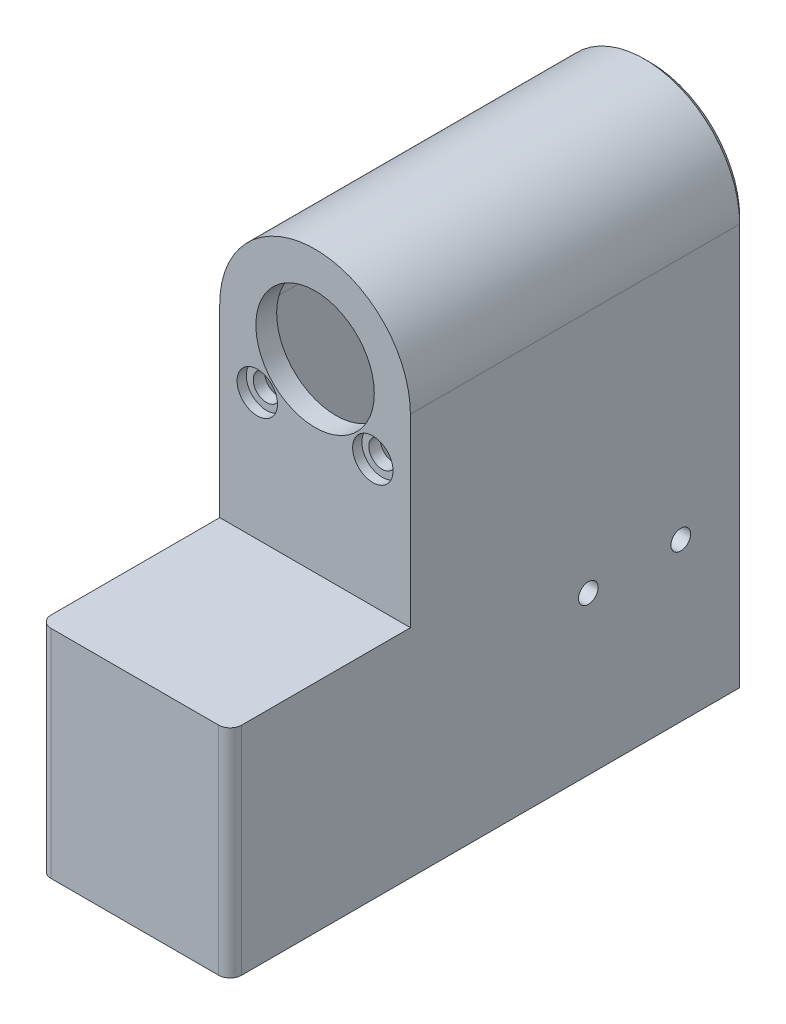
ISO-10303-21;
HEADER;
FILE_DESCRIPTION(('STEP AP214'),'2;1');
FILE_NAME('part.step','',(''),(''),'','','');
FILE_SCHEMA(('AUTOMOTIVE_DESIGN { 1 0 10303 214 1 1 1 1 }'));
ENDSEC;
DATA;
#1=APPLICATION_CONTEXT('core data for automotive mechanical design processes');
#2=APPLICATION_PROTOCOL_DEFINITION('international standard','automotive_design',2000,#1);
#3=PRODUCT_CONTEXT('',#1,'mechanical');
#4=PRODUCT('Part','Part','',(#3));
#5=PRODUCT_RELATED_PRODUCT_CATEGORY('part','',(#4));
#6=PRODUCT_DEFINITION_FORMATION('','',#4);
#7=PRODUCT_DEFINITION_CONTEXT('part definition',#1,'design');
#8=PRODUCT_DEFINITION('design','',#6,#7);
#9=PRODUCT_DEFINITION_SHAPE('','',#8);
#10=(LENGTH_UNIT() NAMED_UNIT(*) SI_UNIT(.MILLI.,.METRE.));
#11=(NAMED_UNIT(*) PLANE_ANGLE_UNIT() SI_UNIT($,.RADIAN.));
#12=(NAMED_UNIT(*) SI_UNIT($,.STERADIAN.) SOLID_ANGLE_UNIT());
#13=UNCERTAINTY_MEASURE_WITH_UNIT(LENGTH_MEASURE(1.E-05),#10,'distance_accuracy_value','');
#14=(GEOMETRIC_REPRESENTATION_CONTEXT(3) GLOBAL_UNCERTAINTY_ASSIGNED_CONTEXT((#13)) GLOBAL_UNIT_ASSIGNED_CONTEXT((#10,
#11,#12)) REPRESENTATION_CONTEXT('',''));
#15=CARTESIAN_POINT('',(0.,0.,0.));
#16=DIRECTION('',(0.,0.,1.));
#17=DIRECTION('',(1.,0.,0.));
#18=AXIS2_PLACEMENT_3D('',#15,#16,#17);
#19=CARTESIAN_POINT('',(37.8083261120685,38.3,40.2));
#20=DIRECTION('',(-1.,0.,0.));
#21=DIRECTION('',(0.,0.,1.));
#22=AXIS2_PLACEMENT_3D('',#19,#20,#21);
#23=CYLINDRICAL_SURFACE('',#22,1.7);
#24=CARTESIAN_POINT('',(3.8,38.3,40.2));
#25=DIRECTION('',(-1.,0.,0.));
#26=DIRECTION('',(0.,0.,1.));
#27=AXIS2_PLACEMENT_3D('',#24,#25,#26);
#28=CIRCLE('',#27,1.7);
#29=CARTESIAN_POINT('',(3.8,38.3,41.9));
#30=VERTEX_POINT('',#29);
#31=EDGE_CURVE('E222',#30,#30,#28,.F.);
#32=ORIENTED_EDGE('',*,*,#31,.T.);
#33=EDGE_LOOP('',(#32));
#34=FACE_BOUND('',#33,.T.);
#35=CARTESIAN_POINT('',(2.,38.3,40.2));
#36=DIRECTION('',(-1.,0.,0.));
#37=DIRECTION('',(0.,0.,1.));
#38=AXIS2_PLACEMENT_3D('',#35,#36,#37);
#39=CIRCLE('',#38,1.7);
#40=CARTESIAN_POINT('',(2.,38.3,41.9));
#41=VERTEX_POINT('',#40);
#42=EDGE_CURVE('E41',#41,#41,#39,.F.);
#43=ORIENTED_EDGE('',*,*,#42,.F.);
#44=EDGE_LOOP('',(#43));
#45=FACE_BOUND('',#44,.T.);
#46=ADVANCED_FACE('F37',(#34,#45),#23,.F.);
#47=CARTESIAN_POINT('',(37.8083261120685,38.3,24.2));
#48=DIRECTION('',(-1.,0.,0.));
#49=DIRECTION('',(0.,0.,1.));
#50=AXIS2_PLACEMENT_3D('',#47,#48,#49);
#51=CYLINDRICAL_SURFACE('',#50,1.7);
#52=CARTESIAN_POINT('',(3.8,38.3,24.2));
#53=DIRECTION('',(-1.,0.,0.));
#54=DIRECTION('',(0.,0.,1.));
#55=AXIS2_PLACEMENT_3D('',#52,#53,#54);
#56=CIRCLE('',#55,1.7);
#57=CARTESIAN_POINT('',(3.8,38.3,25.9));
#58=VERTEX_POINT('',#57);
#59=EDGE_CURVE('E208',#58,#58,#56,.F.);
#60=ORIENTED_EDGE('',*,*,#59,.T.);
#61=EDGE_LOOP('',(#60));
#62=FACE_BOUND('',#61,.T.);
#63=CARTESIAN_POINT('',(2.,38.3,24.2));
#64=DIRECTION('',(-1.,0.,0.));
#65=DIRECTION('',(0.,0.,1.));
#66=AXIS2_PLACEMENT_3D('',#63,#64,#65);
#67=CIRCLE('',#66,1.7);
#68=CARTESIAN_POINT('',(2.,38.3,25.9));
#69=VERTEX_POINT('',#68);
#70=EDGE_CURVE('E346',#69,#69,#67,.F.);
#71=ORIENTED_EDGE('',*,*,#70,.F.);
#72=EDGE_LOOP('',(#71));
#73=FACE_BOUND('',#72,.T.);
#74=ADVANCED_FACE('F417',(#62,#73),#51,.F.);
#75=CARTESIAN_POINT('',(16.5,80.5,13.));
#76=DIRECTION('',(0.,0.,-1.));
#77=DIRECTION('',(-1.,0.,0.));
#78=AXIS2_PLACEMENT_3D('',#75,#76,#77);
#79=PLANE('',#78);
#80=DIRECTION('',(-1.,0.,0.));
#81=VECTOR('',#80,1.);
#82=CARTESIAN_POINT('',(16.5,12.,13.));
#83=LINE('',#82,#81);
#84=CARTESIAN_POINT('',(3.8,12.,13.));
#85=VERTEX_POINT('',#84);
#86=CARTESIAN_POINT('',(1.00000000000001,12.,13.));
#87=VERTEX_POINT('',#86);
#88=EDGE_CURVE('E281',#85,#87,#83,.T.);
#89=ORIENTED_EDGE('',*,*,#88,.T.);
#90=DIRECTION('',(0.,1.,0.));
#91=VECTOR('',#90,1.);
#92=CARTESIAN_POINT('',(1.00000000000001,80.5,13.));
#93=LINE('',#92,#91);
#94=CARTESIAN_POINT('',(1.00000000000001,80.5,13.));
#95=VERTEX_POINT('',#94);
#96=EDGE_CURVE('E331',#87,#95,#93,.T.);
#97=ORIENTED_EDGE('',*,*,#96,.T.);
#98=CARTESIAN_POINT('',(16.5,80.5,13.));
#99=DIRECTION('',(0.,0.,-1.));
#100=DIRECTION('',(-1.,0.,0.));
#101=AXIS2_PLACEMENT_3D('',#98,#99,#100);
#102=CIRCLE('',#101,15.5);
#103=CARTESIAN_POINT('',(32.,80.5,13.));
#104=VERTEX_POINT('',#103);
#105=EDGE_CURVE('E329',#95,#104,#102,.T.);
#106=ORIENTED_EDGE('',*,*,#105,.T.);
#107=DIRECTION('',(0.,-1.,0.));
#108=VECTOR('',#107,1.);
#109=CARTESIAN_POINT('',(32.,12.,13.));
#110=LINE('',#109,#108);
#111=CARTESIAN_POINT('',(32.,12.,13.));
#112=VERTEX_POINT('',#111);
#113=EDGE_CURVE('E327',#104,#112,#110,.T.);
#114=ORIENTED_EDGE('',*,*,#113,.T.);
#115=DIRECTION('',(-1.,0.,0.));
#116=VECTOR('',#115,1.);
#117=CARTESIAN_POINT('',(16.5,12.,13.));
#118=LINE('',#117,#116);
#119=CARTESIAN_POINT('',(29.2,12.,13.));
#120=VERTEX_POINT('',#119);
#121=EDGE_CURVE('E279',#112,#120,#118,.T.);
#122=ORIENTED_EDGE('',*,*,#121,.T.);
#123=DIRECTION('',(0.,1.,0.));
#124=VECTOR('',#123,1.);
#125=CARTESIAN_POINT('',(29.2,11.,13.));
#126=LINE('',#125,#124);
#127=CARTESIAN_POINT('',(29.2,80.4999999999999,13.));
#128=VERTEX_POINT('',#127);
#129=EDGE_CURVE('E182',#120,#128,#126,.T.);
#130=ORIENTED_EDGE('',*,*,#129,.T.);
#131=CARTESIAN_POINT('',(16.5,80.4999999999999,13.));
#132=DIRECTION('',(0.,0.,1.));
#133=DIRECTION('',(1.,0.,0.));
#134=AXIS2_PLACEMENT_3D('',#131,#132,#133);
#135=CIRCLE('',#134,12.7);
#136=CARTESIAN_POINT('',(3.8,80.4999999999999,13.));
#137=VERTEX_POINT('',#136);
#138=EDGE_CURVE('E210',#128,#137,#135,.T.);
#139=ORIENTED_EDGE('',*,*,#138,.T.);
#140=DIRECTION('',(0.,1.,0.));
#141=VECTOR('',#140,1.);
#142=CARTESIAN_POINT('',(3.8,11.0000000000001,13.));
#143=LINE('',#142,#141);
#144=EDGE_CURVE('E213',#85,#137,#143,.T.);
#145=ORIENTED_EDGE('',*,*,#144,.F.);
#146=EDGE_LOOP('',(#89,#97,#106,#114,#122,#130,#139,#145));
#147=FACE_BOUND('',#146,.T.);
#148=ADVANCED_FACE('F425',(#147),#79,.T.);
#149=CARTESIAN_POINT('',(33.,38.3,40.2));
#150=DIRECTION('',(-1.,0.,0.));
#151=DIRECTION('',(0.,0.,1.));
#152=AXIS2_PLACEMENT_3D('',#149,#150,#151);
#153=CIRCLE('',#152,1.7);
#154=CARTESIAN_POINT('',(33.,38.3,41.9));
#155=VERTEX_POINT('',#154);
#156=EDGE_CURVE('E247',#155,#155,#153,.F.);
#157=ORIENTED_EDGE('',*,*,#156,.T.);
#158=EDGE_LOOP('',(#157));
#159=FACE_BOUND('',#158,.T.);
#160=CARTESIAN_POINT('',(29.2,38.3,40.2));
#161=DIRECTION('',(-1.,0.,0.));
#162=DIRECTION('',(0.,0.,1.));
#163=AXIS2_PLACEMENT_3D('',#160,#161,#162);
#164=CIRCLE('',#163,1.7);
#165=CARTESIAN_POINT('',(29.2,38.3,41.9));
#166=VERTEX_POINT('',#165);
#167=EDGE_CURVE('E193',#166,#166,#164,.F.);
#168=ORIENTED_EDGE('',*,*,#167,.F.);
#169=EDGE_LOOP('',(#168));
#170=FACE_BOUND('',#169,.T.);
#171=ADVANCED_FACE('F420',(#159,#170),#23,.F.);
#172=CARTESIAN_POINT('',(33.,38.3,24.2));
#173=DIRECTION('',(-1.,0.,0.));
#174=DIRECTION('',(0.,0.,1.));
#175=AXIS2_PLACEMENT_3D('',#172,#173,#174);
#176=CIRCLE('',#175,1.7);
#177=CARTESIAN_POINT('',(33.,38.3,25.9));
#178=VERTEX_POINT('',#177);
#179=EDGE_CURVE('E248',#178,#178,#176,.F.);
#180=ORIENTED_EDGE('',*,*,#179,.T.);
#181=EDGE_LOOP('',(#180));
#182=FACE_BOUND('',#181,.T.);
#183=CARTESIAN_POINT('',(29.2,38.3,24.2));
#184=DIRECTION('',(-1.,0.,0.));
#185=DIRECTION('',(0.,0.,1.));
#186=AXIS2_PLACEMENT_3D('',#183,#184,#185);
#187=CIRCLE('',#186,1.7);
#188=CARTESIAN_POINT('',(29.2,38.3,25.9));
#189=VERTEX_POINT('',#188);
#190=EDGE_CURVE('E225',#189,#189,#187,.F.);
#191=ORIENTED_EDGE('',*,*,#190,.F.);
#192=EDGE_LOOP('',(#191));
#193=FACE_BOUND('',#192,.T.);
#194=ADVANCED_FACE('F428',(#182,#193),#51,.F.);
#195=CARTESIAN_POINT('',(0.,11.,0.));
#196=DIRECTION('',(0.,-1.,0.));
#197=DIRECTION('',(0.,0.,-1.));
#198=AXIS2_PLACEMENT_3D('',#195,#196,#197);
#199=PLANE('',#198);
#200=DIRECTION('',(0.,0.,1.));
#201=VECTOR('',#200,1.);
#202=CARTESIAN_POINT('',(33.,11.,13.));
#203=LINE('',#202,#201);
#204=CARTESIAN_POINT('',(33.,11.,14.));
#205=VERTEX_POINT('',#204);
#206=CARTESIAN_POINT('',(33.,11.,100.2));
#207=VERTEX_POINT('',#206);
#208=EDGE_CURVE('E192',#205,#207,#203,.T.);
#209=ORIENTED_EDGE('',*,*,#208,.T.);
#210=CARTESIAN_POINT('',(31.,11.,100.2));
#211=DIRECTION('',(0.,-1.,0.));
#212=DIRECTION('',(0.,0.,-1.));
#213=AXIS2_PLACEMENT_3D('',#210,#211,#212);
#214=CIRCLE('',#213,2.);
#215=CARTESIAN_POINT('',(31.,11.,102.2));
#216=VERTEX_POINT('',#215);
#217=EDGE_CURVE('E319',#207,#216,#214,.T.);
#218=ORIENTED_EDGE('',*,*,#217,.T.);
#219=DIRECTION('',(-1.,0.,0.));
#220=VECTOR('',#219,1.);
#221=CARTESIAN_POINT('',(33.,11.,102.2));
#222=LINE('',#221,#220);
#223=CARTESIAN_POINT('',(2.,11.,102.2));
#224=VERTEX_POINT('',#223);
#225=EDGE_CURVE('E232',#216,#224,#222,.T.);
#226=ORIENTED_EDGE('',*,*,#225,.T.);
#227=CARTESIAN_POINT('',(2.,11.,100.2));
#228=DIRECTION('',(0.,-1.,0.));
#229=DIRECTION('',(0.,0.,-1.));
#230=AXIS2_PLACEMENT_3D('',#227,#228,#229);
#231=CIRCLE('',#230,2.);
#232=CARTESIAN_POINT('',(0.,11.,100.2));
#233=VERTEX_POINT('',#232);
#234=EDGE_CURVE('E317',#224,#233,#231,.T.);
#235=ORIENTED_EDGE('',*,*,#234,.T.);
#236=DIRECTION('',(0.,0.,-1.));
#237=VECTOR('',#236,1.);
#238=CARTESIAN_POINT('',(0.,11.,102.2));
#239=LINE('',#238,#237);
#240=CARTESIAN_POINT('',(0.,11.,14.));
#241=VERTEX_POINT('',#240);
#242=EDGE_CURVE('E235',#233,#241,#239,.T.);
#243=ORIENTED_EDGE('',*,*,#242,.T.);
#244=DIRECTION('',(1.,0.,0.));
#245=VECTOR('',#244,1.);
#246=CARTESIAN_POINT('',(0.,11.,14.));
#247=LINE('',#246,#245);
#248=CARTESIAN_POINT('',(3.8,11.0000000000001,14.));
#249=VERTEX_POINT('',#248);
#250=EDGE_CURVE('E274',#241,#249,#247,.T.);
#251=ORIENTED_EDGE('',*,*,#250,.T.);
#252=DIRECTION('',(0.,0.,-1.));
#253=VECTOR('',#252,1.);
#254=CARTESIAN_POINT('',(3.8,11.0000000000001,153.43487664895));
#255=LINE('',#254,#253);
#256=CARTESIAN_POINT('',(3.8,11.0000000000001,96.2));
#257=VERTEX_POINT('',#256);
#258=EDGE_CURVE('E215',#257,#249,#255,.T.);
#259=ORIENTED_EDGE('',*,*,#258,.F.);
#260=CARTESIAN_POINT('',(5.8,11.,96.2));
#261=DIRECTION('',(0.,-1.,0.));
#262=DIRECTION('',(0.,0.,-1.));
#263=AXIS2_PLACEMENT_3D('',#260,#261,#262);
#264=CIRCLE('',#263,2.);
#265=CARTESIAN_POINT('',(5.8,11.0000000000001,98.2));
#266=VERTEX_POINT('',#265);
#267=EDGE_CURVE('E325',#257,#266,#264,.F.);
#268=ORIENTED_EDGE('',*,*,#267,.T.);
#269=DIRECTION('',(-1.,0.,0.));
#270=VECTOR('',#269,1.);
#271=CARTESIAN_POINT('',(29.2,11.,98.2));
#272=LINE('',#271,#270);
#273=CARTESIAN_POINT('',(27.2,11.,98.2));
#274=VERTEX_POINT('',#273);
#275=EDGE_CURVE('E379',#274,#266,#272,.T.);
#276=ORIENTED_EDGE('',*,*,#275,.F.);
#277=CARTESIAN_POINT('',(27.2,11.,96.2));
#278=DIRECTION('',(0.,-1.,0.));
#279=DIRECTION('',(0.,0.,-1.));
#280=AXIS2_PLACEMENT_3D('',#277,#278,#279);
#281=CIRCLE('',#280,2.);
#282=CARTESIAN_POINT('',(29.2,11.,96.2));
#283=VERTEX_POINT('',#282);
#284=EDGE_CURVE('E323',#274,#283,#281,.F.);
#285=ORIENTED_EDGE('',*,*,#284,.T.);
#286=DIRECTION('',(0.,0.,-1.));
#287=VECTOR('',#286,1.);
#288=CARTESIAN_POINT('',(29.2,11.,153.43487664895));
#289=LINE('',#288,#287);
#290=CARTESIAN_POINT('',(29.2,11.,14.));
#291=VERTEX_POINT('',#290);
#292=EDGE_CURVE('E200',#283,#291,#289,.T.);
#293=ORIENTED_EDGE('',*,*,#292,.T.);
#294=DIRECTION('',(1.,0.,0.));
#295=VECTOR('',#294,1.);
#296=CARTESIAN_POINT('',(0.,11.,14.));
#297=LINE('',#296,#295);
#298=EDGE_CURVE('E271',#291,#205,#297,.T.);
#299=ORIENTED_EDGE('',*,*,#298,.T.);
#300=EDGE_LOOP('',(#209,#218,#226,#235,#243,#251,#259,#268,#276,#285,#293,#299));
#301=FACE_BOUND('',#300,.T.);
#302=ADVANCED_FACE('F437',(#301),#199,.T.);
#303=CARTESIAN_POINT('',(0.,44.9,0.));
#304=DIRECTION('',(0.,-1.,0.));
#305=DIRECTION('',(0.,0.,-1.));
#306=AXIS2_PLACEMENT_3D('',#303,#304,#305);
#307=PLANE('',#306);
#308=DIRECTION('',(0.,0.,-1.));
#309=VECTOR('',#308,1.);
#310=CARTESIAN_POINT('',(29.2,44.9,134.100589965368));
#311=LINE('',#310,#309);
#312=CARTESIAN_POINT('',(29.2,44.9,96.2));
#313=VERTEX_POINT('',#312);
#314=CARTESIAN_POINT('',(29.2,44.9,67.4));
#315=VERTEX_POINT('',#314);
#316=EDGE_CURVE('E183',#313,#315,#311,.T.);
#317=ORIENTED_EDGE('',*,*,#316,.F.);
#318=CARTESIAN_POINT('',(27.2,44.9,96.2));
#319=DIRECTION('',(0.,-1.,0.));
#320=DIRECTION('',(0.,0.,-1.));
#321=AXIS2_PLACEMENT_3D('',#318,#319,#320);
#322=CIRCLE('',#321,2.);
#323=CARTESIAN_POINT('',(27.2,44.9,98.2));
#324=VERTEX_POINT('',#323);
#325=EDGE_CURVE('E301',#313,#324,#322,.T.);
#326=ORIENTED_EDGE('',*,*,#325,.T.);
#327=DIRECTION('',(1.,0.,0.));
#328=VECTOR('',#327,1.);
#329=CARTESIAN_POINT('',(3.8,44.9,98.2));
#330=LINE('',#329,#328);
#331=CARTESIAN_POINT('',(5.8,44.9,98.2));
#332=VERTEX_POINT('',#331);
#333=EDGE_CURVE('E345',#332,#324,#330,.T.);
#334=ORIENTED_EDGE('',*,*,#333,.F.);
#335=CARTESIAN_POINT('',(5.8,44.9,96.2));
#336=DIRECTION('',(0.,-1.,0.));
#337=DIRECTION('',(0.,0.,-1.));
#338=AXIS2_PLACEMENT_3D('',#335,#336,#337);
#339=CIRCLE('',#338,2.);
#340=CARTESIAN_POINT('',(3.8,44.9,96.2));
#341=VERTEX_POINT('',#340);
#342=EDGE_CURVE('E178',#332,#341,#339,.T.);
#343=ORIENTED_EDGE('',*,*,#342,.T.);
#344=DIRECTION('',(0.,0.,-1.));
#345=VECTOR('',#344,1.);
#346=CARTESIAN_POINT('',(3.8,44.9,134.100589965368));
#347=LINE('',#346,#345);
#348=CARTESIAN_POINT('',(3.8,44.9,67.4));
#349=VERTEX_POINT('',#348);
#350=EDGE_CURVE('E171',#341,#349,#347,.T.);
#351=ORIENTED_EDGE('',*,*,#350,.T.);
#352=DIRECTION('',(-1.,0.,0.));
#353=VECTOR('',#352,1.);
#354=CARTESIAN_POINT('',(29.,44.9,67.4));
#355=LINE('',#354,#353);
#356=EDGE_CURVE('E175',#315,#349,#355,.T.);
#357=ORIENTED_EDGE('',*,*,#356,.F.);
#358=EDGE_LOOP('',(#317,#326,#334,#343,#351,#357));
#359=FACE_BOUND('',#358,.T.);
#360=ADVANCED_FACE('F174',(#359),#307,.T.);
#361=CARTESIAN_POINT('',(33.,0.,71.));
#362=DIRECTION('',(-1.,0.,0.));
#363=DIRECTION('',(0.,0.,1.));
#364=AXIS2_PLACEMENT_3D('',#361,#362,#363);
#365=PLANE('',#364);
#366=ORIENTED_EDGE('',*,*,#179,.F.);
#367=EDGE_LOOP('',(#366));
#368=FACE_BOUND('',#367,.T.);
#369=ORIENTED_EDGE('',*,*,#156,.F.);
#370=EDGE_LOOP('',(#369));
#371=FACE_BOUND('',#370,.T.);
#372=ORIENTED_EDGE('',*,*,#208,.F.);
#373=DIRECTION('',(0.,1.,0.));
#374=VECTOR('',#373,1.);
#375=CARTESIAN_POINT('',(33.,80.5,14.));
#376=LINE('',#375,#374);
#377=CARTESIAN_POINT('',(33.,80.5,14.));
#378=VERTEX_POINT('',#377);
#379=EDGE_CURVE('E11',#205,#378,#376,.T.);
#380=ORIENTED_EDGE('',*,*,#379,.T.);
#381=DIRECTION('',(0.,0.,-1.));
#382=VECTOR('',#381,1.);
#383=CARTESIAN_POINT('',(33.,80.5,71.));
#384=LINE('',#383,#382);
#385=CARTESIAN_POINT('',(33.,80.5,71.));
#386=VERTEX_POINT('',#385);
#387=EDGE_CURVE('E269',#386,#378,#384,.T.);
#388=ORIENTED_EDGE('',*,*,#387,.F.);
#389=DIRECTION('',(0.,1.,0.));
#390=VECTOR('',#389,1.);
#391=CARTESIAN_POINT('',(33.,0.,71.));
#392=LINE('',#391,#390);
#393=CARTESIAN_POINT('',(33.,48.5,71.));
#394=VERTEX_POINT('',#393);
#395=EDGE_CURVE('E260',#394,#386,#392,.T.);
#396=ORIENTED_EDGE('',*,*,#395,.F.);
#397=DIRECTION('',(0.,0.,-1.));
#398=VECTOR('',#397,1.);
#399=CARTESIAN_POINT('',(33.,48.5,101.2));
#400=LINE('',#399,#398);
#401=CARTESIAN_POINT('',(33.,48.5,100.2));
#402=VERTEX_POINT('',#401);
#403=EDGE_CURVE('E254',#402,#394,#400,.T.);
#404=ORIENTED_EDGE('',*,*,#403,.F.);
#405=DIRECTION('',(0.,1.,0.));
#406=VECTOR('',#405,1.);
#407=CARTESIAN_POINT('',(33.,11.,100.2));
#408=LINE('',#407,#406);
#409=EDGE_CURVE('E315',#402,#207,#408,.F.);
#410=ORIENTED_EDGE('',*,*,#409,.T.);
#411=EDGE_LOOP('',(#372,#380,#388,#396,#404,#410));
#412=FACE_BOUND('',#411,.T.);
#413=ADVANCED_FACE('F466',(#368,#371,#412),#365,.F.);
#414=CARTESIAN_POINT('',(0.,0.,71.));
#415=DIRECTION('',(-1.,0.,0.));
#416=DIRECTION('',(0.,0.,1.));
#417=AXIS2_PLACEMENT_3D('',#414,#415,#416);
#418=PLANE('',#417);
#419=CARTESIAN_POINT('',(0.,38.3,24.2));
#420=DIRECTION('',(-1.,0.,0.));
#421=DIRECTION('',(0.,0.,1.));
#422=AXIS2_PLACEMENT_3D('',#419,#420,#421);
#423=CIRCLE('',#422,3.5);
#424=CARTESIAN_POINT('',(0.,38.3,27.7));
#425=VERTEX_POINT('',#424);
#426=EDGE_CURVE('E354',#425,#425,#423,.T.);
#427=ORIENTED_EDGE('',*,*,#426,.F.);
#428=EDGE_LOOP('',(#427));
#429=FACE_BOUND('',#428,.T.);
#430=CARTESIAN_POINT('',(0.,38.3,40.2));
#431=DIRECTION('',(-1.,0.,0.));
#432=DIRECTION('',(0.,0.,1.));
#433=AXIS2_PLACEMENT_3D('',#430,#431,#432);
#434=CIRCLE('',#433,3.5);
#435=CARTESIAN_POINT('',(0.,38.3,43.7));
#436=VERTEX_POINT('',#435);
#437=EDGE_CURVE('E364',#436,#436,#434,.T.);
#438=ORIENTED_EDGE('',*,*,#437,.F.);
#439=EDGE_LOOP('',(#438));
#440=FACE_BOUND('',#439,.T.);
#441=DIRECTION('',(0.,0.,-1.));
#442=VECTOR('',#441,1.);
#443=CARTESIAN_POINT('',(0.,80.5,71.));
#444=LINE('',#443,#442);
#445=CARTESIAN_POINT('',(0.,80.5,71.));
#446=VERTEX_POINT('',#445);
#447=CARTESIAN_POINT('',(0.,80.5,14.));
#448=VERTEX_POINT('',#447);
#449=EDGE_CURVE('E267',#446,#448,#444,.T.);
#450=ORIENTED_EDGE('',*,*,#449,.T.);
#451=DIRECTION('',(0.,-1.,0.));
#452=VECTOR('',#451,1.);
#453=CARTESIAN_POINT('',(0.,0.,14.));
#454=LINE('',#453,#452);
#455=EDGE_CURVE('E334',#448,#241,#454,.T.);
#456=ORIENTED_EDGE('',*,*,#455,.T.);
#457=ORIENTED_EDGE('',*,*,#242,.F.);
#458=DIRECTION('',(0.,-1.,0.));
#459=VECTOR('',#458,1.);
#460=CARTESIAN_POINT('',(0.,0.,100.2));
#461=LINE('',#460,#459);
#462=CARTESIAN_POINT('',(0.,48.5,100.2));
#463=VERTEX_POINT('',#462);
#464=EDGE_CURVE('E321',#233,#463,#461,.F.);
#465=ORIENTED_EDGE('',*,*,#464,.T.);
#466=DIRECTION('',(0.,0.,-1.));
#467=VECTOR('',#466,1.);
#468=CARTESIAN_POINT('',(0.,48.5,101.2));
#469=LINE('',#468,#467);
#470=CARTESIAN_POINT('',(0.,48.5,71.));
#471=VERTEX_POINT('',#470);
#472=EDGE_CURVE('E251',#463,#471,#469,.T.);
#473=ORIENTED_EDGE('',*,*,#472,.T.);
#474=DIRECTION('',(0.,1.,0.));
#475=VECTOR('',#474,1.);
#476=CARTESIAN_POINT('',(0.,0.,71.));
#477=LINE('',#476,#475);
#478=EDGE_CURVE('E265',#471,#446,#477,.T.);
#479=ORIENTED_EDGE('',*,*,#478,.T.);
#480=EDGE_LOOP('',(#450,#456,#457,#465,#473,#479));
#481=FACE_BOUND('',#480,.T.);
#482=ADVANCED_FACE('F481',(#429,#440,#481),#418,.T.);
#483=CARTESIAN_POINT('',(0.,0.,102.2));
#484=DIRECTION('',(0.,0.,1.));
#485=DIRECTION('',(1.,0.,0.));
#486=AXIS2_PLACEMENT_3D('',#483,#484,#485);
#487=PLANE('',#486);
#488=ORIENTED_EDGE('',*,*,#225,.F.);
#489=DIRECTION('',(0.,1.,0.));
#490=VECTOR('',#489,1.);
#491=CARTESIAN_POINT('',(31.,48.5,102.2));
#492=LINE('',#491,#490);
#493=CARTESIAN_POINT('',(31.,48.5,102.2));
#494=VERTEX_POINT('',#493);
#495=EDGE_CURVE('E308',#216,#494,#492,.T.);
#496=ORIENTED_EDGE('',*,*,#495,.T.);
#497=DIRECTION('',(-1.,0.,0.));
#498=VECTOR('',#497,1.);
#499=CARTESIAN_POINT('',(33.,48.5,102.2));
#500=LINE('',#499,#498);
#501=CARTESIAN_POINT('',(2.,48.5,102.2));
#502=VERTEX_POINT('',#501);
#503=EDGE_CURVE('E242',#494,#502,#500,.T.);
#504=ORIENTED_EDGE('',*,*,#503,.T.);
#505=DIRECTION('',(0.,-1.,0.));
#506=VECTOR('',#505,1.);
#507=CARTESIAN_POINT('',(2.,0.,102.2));
#508=LINE('',#507,#506);
#509=EDGE_CURVE('E305',#502,#224,#508,.T.);
#510=ORIENTED_EDGE('',*,*,#509,.T.);
#511=EDGE_LOOP('',(#488,#496,#504,#510));
#512=FACE_BOUND('',#511,.T.);
#513=ADVANCED_FACE('F478',(#512),#487,.T.);
#514=CARTESIAN_POINT('',(0.,48.5,101.2));
#515=DIRECTION('',(0.,-1.,0.));
#516=DIRECTION('',(0.,0.,-1.));
#517=AXIS2_PLACEMENT_3D('',#514,#515,#516);
#518=PLANE('',#517);
#519=ORIENTED_EDGE('',*,*,#503,.F.);
#520=CARTESIAN_POINT('',(31.,48.5,100.2));
#521=DIRECTION('',(0.,-1.,0.));
#522=DIRECTION('',(0.,0.,-1.));
#523=AXIS2_PLACEMENT_3D('',#520,#521,#522);
#524=CIRCLE('',#523,2.);
#525=EDGE_CURVE('E313',#494,#402,#524,.F.);
#526=ORIENTED_EDGE('',*,*,#525,.T.);
#527=ORIENTED_EDGE('',*,*,#403,.T.);
#528=DIRECTION('',(1.,0.,0.));
#529=VECTOR('',#528,1.);
#530=CARTESIAN_POINT('',(33.,48.5,71.));
#531=LINE('',#530,#529);
#532=EDGE_CURVE('E256',#471,#394,#531,.T.);
#533=ORIENTED_EDGE('',*,*,#532,.F.);
#534=ORIENTED_EDGE('',*,*,#472,.F.);
#535=CARTESIAN_POINT('',(2.,48.5,100.2));
#536=DIRECTION('',(0.,-1.,0.));
#537=DIRECTION('',(0.,0.,-1.));
#538=AXIS2_PLACEMENT_3D('',#535,#536,#537);
#539=CIRCLE('',#538,2.);
#540=EDGE_CURVE('E311',#463,#502,#539,.F.);
#541=ORIENTED_EDGE('',*,*,#540,.T.);
#542=EDGE_LOOP('',(#519,#526,#527,#533,#534,#541));
#543=FACE_BOUND('',#542,.T.);
#544=ADVANCED_FACE('F480',(#543),#518,.F.);
#545=CARTESIAN_POINT('',(0.,0.,71.));
#546=DIRECTION('',(0.,0.,1.));
#547=DIRECTION('',(1.,0.,0.));
#548=AXIS2_PLACEMENT_3D('',#545,#546,#547);
#549=PLANE('',#548);
#550=CARTESIAN_POINT('',(16.5,80.5,71.));
#551=DIRECTION('',(0.,0.,1.));
#552=DIRECTION('',(1.,0.,0.));
#553=AXIS2_PLACEMENT_3D('',#550,#551,#552);
#554=CIRCLE('',#553,10.25);
#555=CARTESIAN_POINT('',(26.75,80.5,71.));
#556=VERTEX_POINT('',#555);
#557=EDGE_CURVE('E292',#556,#556,#554,.T.);
#558=ORIENTED_EDGE('',*,*,#557,.F.);
#559=EDGE_LOOP('',(#558));
#560=FACE_BOUND('',#559,.T.);
#561=CARTESIAN_POINT('',(6.5,70.5,71.));
#562=DIRECTION('',(0.,0.,1.));
#563=DIRECTION('',(1.,0.,0.));
#564=AXIS2_PLACEMENT_3D('',#561,#562,#563);
#565=CIRCLE('',#564,3.5);
#566=CARTESIAN_POINT('',(10.,70.5,71.));
#567=VERTEX_POINT('',#566);
#568=EDGE_CURVE('E239',#567,#567,#565,.T.);
#569=ORIENTED_EDGE('',*,*,#568,.F.);
#570=EDGE_LOOP('',(#569));
#571=FACE_BOUND('',#570,.T.);
#572=CARTESIAN_POINT('',(26.5,70.5,71.));
#573=DIRECTION('',(0.,0.,1.));
#574=DIRECTION('',(1.,0.,0.));
#575=AXIS2_PLACEMENT_3D('',#572,#573,#574);
#576=CIRCLE('',#575,3.5);
#577=CARTESIAN_POINT('',(30.,70.5,71.));
#578=VERTEX_POINT('',#577);
#579=EDGE_CURVE('E238',#578,#578,#576,.T.);
#580=ORIENTED_EDGE('',*,*,#579,.F.);
#581=EDGE_LOOP('',(#580));
#582=FACE_BOUND('',#581,.T.);
#583=ORIENTED_EDGE('',*,*,#478,.F.);
#584=ORIENTED_EDGE('',*,*,#532,.T.);
#585=ORIENTED_EDGE('',*,*,#395,.T.);
#586=CARTESIAN_POINT('',(16.5,80.5,71.));
#587=DIRECTION('',(0.,0.,1.));
#588=DIRECTION('',(1.,0.,0.));
#589=AXIS2_PLACEMENT_3D('',#586,#587,#588);
#590=CIRCLE('',#589,16.5);
#591=EDGE_CURVE('E262',#386,#446,#590,.T.);
#592=ORIENTED_EDGE('',*,*,#591,.T.);
#593=EDGE_LOOP('',(#583,#584,#585,#592));
#594=FACE_BOUND('',#593,.T.);
#595=ADVANCED_FACE('F485',(#560,#571,#582,#594),#549,.T.);
#596=CARTESIAN_POINT('',(16.5,80.5,71.));
#597=DIRECTION('',(0.,0.,-1.));
#598=DIRECTION('',(-1.,0.,0.));
#599=AXIS2_PLACEMENT_3D('',#596,#597,#598);
#600=CYLINDRICAL_SURFACE('',#599,16.5);
#601=ORIENTED_EDGE('',*,*,#387,.T.);
#602=CARTESIAN_POINT('',(16.5,80.5,14.));
#603=DIRECTION('',(0.,0.,-1.));
#604=DIRECTION('',(-1.,0.,0.));
#605=AXIS2_PLACEMENT_3D('',#602,#603,#604);
#606=CIRCLE('',#605,16.5);
#607=EDGE_CURVE('E59',#378,#448,#606,.F.);
#608=ORIENTED_EDGE('',*,*,#607,.T.);
#609=ORIENTED_EDGE('',*,*,#449,.F.);
#610=ORIENTED_EDGE('',*,*,#591,.F.);
#611=EDGE_LOOP('',(#601,#608,#609,#610));
#612=FACE_BOUND('',#611,.T.);
#613=ADVANCED_FACE('F476',(#612),#600,.T.);
#614=CARTESIAN_POINT('',(26.5,70.5,58.6005050633883));
#615=DIRECTION('',(0.,0.,1.));
#616=DIRECTION('',(1.,0.,0.));
#617=AXIS2_PLACEMENT_3D('',#614,#615,#616);
#618=CYLINDRICAL_SURFACE('',#617,3.5);
#619=CARTESIAN_POINT('',(26.5,70.5,69.4));
#620=DIRECTION('',(0.,0.,1.));
#621=DIRECTION('',(1.,0.,0.));
#622=AXIS2_PLACEMENT_3D('',#619,#620,#621);
#623=CIRCLE('',#622,3.5);
#624=CARTESIAN_POINT('',(30.,70.5,69.4));
#625=VERTEX_POINT('',#624);
#626=EDGE_CURVE('E369',#625,#625,#623,.T.);
#627=ORIENTED_EDGE('',*,*,#626,.F.);
#628=EDGE_LOOP('',(#627));
#629=FACE_BOUND('',#628,.T.);
#630=ORIENTED_EDGE('',*,*,#579,.T.);
#631=EDGE_LOOP('',(#630));
#632=FACE_BOUND('',#631,.T.);
#633=ADVANCED_FACE('F472',(#629,#632),#618,.F.);
#634=CARTESIAN_POINT('',(6.5,70.5,58.6005050633883));
#635=DIRECTION('',(0.,0.,1.));
#636=DIRECTION('',(1.,0.,0.));
#637=AXIS2_PLACEMENT_3D('',#634,#635,#636);
#638=CYLINDRICAL_SURFACE('',#637,3.5);
#639=CARTESIAN_POINT('',(6.5,70.5,69.4));
#640=DIRECTION('',(0.,0.,1.));
#641=DIRECTION('',(1.,0.,0.));
#642=AXIS2_PLACEMENT_3D('',#639,#640,#641);
#643=CIRCLE('',#642,3.5);
#644=CARTESIAN_POINT('',(10.,70.5,69.4));
#645=VERTEX_POINT('',#644);
#646=EDGE_CURVE('E343',#645,#645,#643,.T.);
#647=ORIENTED_EDGE('',*,*,#646,.F.);
#648=EDGE_LOOP('',(#647));
#649=FACE_BOUND('',#648,.T.);
#650=ORIENTED_EDGE('',*,*,#568,.T.);
#651=EDGE_LOOP('',(#650));
#652=FACE_BOUND('',#651,.T.);
#653=ADVANCED_FACE('F457',(#649,#652),#638,.F.);
#654=CARTESIAN_POINT('',(16.5,80.5,67.4));
#655=DIRECTION('',(0.,0.,-1.));
#656=DIRECTION('',(-1.,0.,0.));
#657=AXIS2_PLACEMENT_3D('',#654,#655,#656);
#658=PLANE('',#657);
#659=CARTESIAN_POINT('',(16.5,80.5,67.4));
#660=DIRECTION('',(0.,0.,-1.));
#661=DIRECTION('',(-1.,0.,0.));
#662=AXIS2_PLACEMENT_3D('',#659,#660,#661);
#663=CIRCLE('',#662,10.25);
#664=CARTESIAN_POINT('',(6.25,80.5,67.4));
#665=VERTEX_POINT('',#664);
#666=EDGE_CURVE('E288',#665,#665,#663,.T.);
#667=ORIENTED_EDGE('',*,*,#666,.F.);
#668=EDGE_LOOP('',(#667));
#669=FACE_BOUND('',#668,.T.);
#670=CARTESIAN_POINT('',(26.5,70.5,67.4));
#671=DIRECTION('',(0.,0.,-1.));
#672=DIRECTION('',(-1.,0.,0.));
#673=AXIS2_PLACEMENT_3D('',#670,#671,#672);
#674=CIRCLE('',#673,2.3);
#675=CARTESIAN_POINT('',(24.2,70.5,67.4));
#676=VERTEX_POINT('',#675);
#677=EDGE_CURVE('E384',#676,#676,#674,.F.);
#678=ORIENTED_EDGE('',*,*,#677,.T.);
#679=EDGE_LOOP('',(#678));
#680=FACE_BOUND('',#679,.T.);
#681=CARTESIAN_POINT('',(6.5,70.5,67.4));
#682=DIRECTION('',(0.,0.,-1.));
#683=DIRECTION('',(-1.,0.,0.));
#684=AXIS2_PLACEMENT_3D('',#681,#682,#683);
#685=CIRCLE('',#684,2.3);
#686=CARTESIAN_POINT('',(4.2,70.5,67.4));
#687=VERTEX_POINT('',#686);
#688=EDGE_CURVE('E291',#687,#687,#685,.F.);
#689=ORIENTED_EDGE('',*,*,#688,.T.);
#690=EDGE_LOOP('',(#689));
#691=FACE_BOUND('',#690,.T.);
#692=ORIENTED_EDGE('',*,*,#356,.T.);
#693=DIRECTION('',(0.,-1.,0.));
#694=VECTOR('',#693,1.);
#695=CARTESIAN_POINT('',(3.8,11.0000000000001,67.4));
#696=LINE('',#695,#694);
#697=CARTESIAN_POINT('',(3.8,80.4999999999999,67.4));
#698=VERTEX_POINT('',#697);
#699=EDGE_CURVE('E189',#698,#349,#696,.T.);
#700=ORIENTED_EDGE('',*,*,#699,.F.);
#701=CARTESIAN_POINT('',(16.5,80.4999999999999,67.4));
#702=DIRECTION('',(0.,0.,-1.));
#703=DIRECTION('',(-1.,0.,0.));
#704=AXIS2_PLACEMENT_3D('',#701,#702,#703);
#705=CIRCLE('',#704,12.7);
#706=CARTESIAN_POINT('',(29.2,80.4999999999999,67.4));
#707=VERTEX_POINT('',#706);
#708=EDGE_CURVE('E199',#698,#707,#705,.T.);
#709=ORIENTED_EDGE('',*,*,#708,.T.);
#710=DIRECTION('',(0.,-1.,0.));
#711=VECTOR('',#710,1.);
#712=CARTESIAN_POINT('',(29.2,11.,67.4));
#713=LINE('',#712,#711);
#714=EDGE_CURVE('E191',#707,#315,#713,.T.);
#715=ORIENTED_EDGE('',*,*,#714,.T.);
#716=EDGE_LOOP('',(#692,#700,#709,#715));
#717=FACE_BOUND('',#716,.T.);
#718=ADVANCED_FACE('F187',(#669,#680,#691,#717),#658,.T.);
#719=CARTESIAN_POINT('',(29.2,11.,153.43487664895));
#720=DIRECTION('',(-1.,0.,0.));
#721=DIRECTION('',(0.,0.,1.));
#722=AXIS2_PLACEMENT_3D('',#719,#720,#721);
#723=PLANE('',#722);
#724=ORIENTED_EDGE('',*,*,#292,.F.);
#725=DIRECTION('',(0.,-1.,0.));
#726=VECTOR('',#725,1.);
#727=CARTESIAN_POINT('',(29.2,44.9,96.2));
#728=LINE('',#727,#726);
#729=EDGE_CURVE('E298',#283,#313,#728,.F.);
#730=ORIENTED_EDGE('',*,*,#729,.T.);
#731=ORIENTED_EDGE('',*,*,#316,.T.);
#732=ORIENTED_EDGE('',*,*,#714,.F.);
#733=DIRECTION('',(0.,0.,-1.));
#734=VECTOR('',#733,1.);
#735=CARTESIAN_POINT('',(29.2,80.4999999999999,153.43487664895));
#736=LINE('',#735,#734);
#737=EDGE_CURVE('E203',#707,#128,#736,.T.);
#738=ORIENTED_EDGE('',*,*,#737,.T.);
#739=ORIENTED_EDGE('',*,*,#129,.F.);
#740=DIRECTION('',(0.,0.707106781186541,-0.707106781186554));
#741=VECTOR('',#740,1.);
#742=CARTESIAN_POINT('',(29.2,-58.7174383244748,83.7174383244761));
#743=LINE('',#742,#741);
#744=EDGE_CURVE('E284',#120,#291,#743,.F.);
#745=ORIENTED_EDGE('',*,*,#744,.T.);
#746=EDGE_LOOP('',(#724,#730,#731,#732,#738,#739,#745));
#747=FACE_BOUND('',#746,.T.);
#748=ORIENTED_EDGE('',*,*,#190,.T.);
#749=EDGE_LOOP('',(#748));
#750=FACE_BOUND('',#749,.T.);
#751=ORIENTED_EDGE('',*,*,#167,.T.);
#752=EDGE_LOOP('',(#751));
#753=FACE_BOUND('',#752,.T.);
#754=ADVANCED_FACE('F445',(#747,#750,#753),#723,.T.);
#755=CARTESIAN_POINT('',(3.8,11.0000000000001,153.43487664895));
#756=DIRECTION('',(-1.,0.,0.));
#757=DIRECTION('',(0.,0.,1.));
#758=AXIS2_PLACEMENT_3D('',#755,#756,#757);
#759=PLANE('',#758);
#760=ORIENTED_EDGE('',*,*,#59,.F.);
#761=EDGE_LOOP('',(#760));
#762=FACE_BOUND('',#761,.T.);
#763=ORIENTED_EDGE('',*,*,#350,.F.);
#764=DIRECTION('',(0.,1.,0.));
#765=VECTOR('',#764,1.);
#766=CARTESIAN_POINT('',(3.8,11.0000000000001,96.2));
#767=LINE('',#766,#765);
#768=EDGE_CURVE('E303',#341,#257,#767,.F.);
#769=ORIENTED_EDGE('',*,*,#768,.T.);
#770=ORIENTED_EDGE('',*,*,#258,.T.);
#771=DIRECTION('',(0.,-0.707106781186541,0.707106781186554));
#772=VECTOR('',#771,1.);
#773=CARTESIAN_POINT('',(3.8,11.,14.));
#774=LINE('',#773,#772);
#775=EDGE_CURVE('E277',#249,#85,#774,.F.);
#776=ORIENTED_EDGE('',*,*,#775,.T.);
#777=ORIENTED_EDGE('',*,*,#144,.T.);
#778=DIRECTION('',(0.,0.,-1.));
#779=VECTOR('',#778,1.);
#780=CARTESIAN_POINT('',(3.8,80.4999999999999,153.43487664895));
#781=LINE('',#780,#779);
#782=EDGE_CURVE('E198',#698,#137,#781,.T.);
#783=ORIENTED_EDGE('',*,*,#782,.F.);
#784=ORIENTED_EDGE('',*,*,#699,.T.);
#785=EDGE_LOOP('',(#763,#769,#770,#776,#777,#783,#784));
#786=FACE_BOUND('',#785,.T.);
#787=ORIENTED_EDGE('',*,*,#31,.F.);
#788=EDGE_LOOP('',(#787));
#789=FACE_BOUND('',#788,.T.);
#790=ADVANCED_FACE('F195',(#762,#786,#789),#759,.F.);
#791=CARTESIAN_POINT('',(16.5,80.4999999999999,153.43487664895));
#792=DIRECTION('',(0.,0.,-1.));
#793=DIRECTION('',(-1.,0.,0.));
#794=AXIS2_PLACEMENT_3D('',#791,#792,#793);
#795=CYLINDRICAL_SURFACE('',#794,12.7);
#796=ORIENTED_EDGE('',*,*,#782,.T.);
#797=ORIENTED_EDGE('',*,*,#138,.F.);
#798=ORIENTED_EDGE('',*,*,#737,.F.);
#799=ORIENTED_EDGE('',*,*,#708,.F.);
#800=EDGE_LOOP('',(#796,#797,#798,#799));
#801=FACE_BOUND('',#800,.T.);
#802=ADVANCED_FACE('F453',(#801),#795,.F.);
#803=CARTESIAN_POINT('',(0.,11.,14.));
#804=DIRECTION('',(0.,0.707106781186554,0.707106781186541));
#805=DIRECTION('',(1.,0.,0.));
#806=AXIS2_PLACEMENT_3D('',#803,#804,#805);
#807=PLANE('',#806);
#808=ORIENTED_EDGE('',*,*,#250,.F.);
#809=DIRECTION('',(0.57735026918963,0.577350269189619,-0.577350269189629));
#810=VECTOR('',#809,1.);
#811=CARTESIAN_POINT('',(0.,11.,14.));
#812=LINE('',#811,#810);
#813=EDGE_CURVE('E336',#241,#87,#812,.T.);
#814=ORIENTED_EDGE('',*,*,#813,.T.);
#815=ORIENTED_EDGE('',*,*,#88,.F.);
#816=ORIENTED_EDGE('',*,*,#775,.F.);
#817=EDGE_LOOP('',(#808,#814,#815,#816));
#818=FACE_BOUND('',#817,.T.);
#819=ADVANCED_FACE('F525',(#818),#807,.F.);
#820=CARTESIAN_POINT('',(0.,11.,14.));
#821=DIRECTION('',(0.,0.707106781186554,0.707106781186541));
#822=DIRECTION('',(1.,0.,0.));
#823=AXIS2_PLACEMENT_3D('',#820,#821,#822);
#824=PLANE('',#823);
#825=ORIENTED_EDGE('',*,*,#121,.F.);
#826=DIRECTION('',(-0.57735026918963,0.577350269189619,-0.577350269189629));
#827=VECTOR('',#826,1.);
#828=CARTESIAN_POINT('',(21.9999999999998,21.9999999999999,2.99999999999987));
#829=LINE('',#828,#827);
#830=EDGE_CURVE('E46',#112,#205,#829,.F.);
#831=ORIENTED_EDGE('',*,*,#830,.T.);
#832=ORIENTED_EDGE('',*,*,#298,.F.);
#833=ORIENTED_EDGE('',*,*,#744,.F.);
#834=EDGE_LOOP('',(#825,#831,#832,#833));
#835=FACE_BOUND('',#834,.T.);
#836=ADVANCED_FACE('F395',(#835),#824,.F.);
#837=CARTESIAN_POINT('',(6.5,70.5,60.8946176130838));
#838=DIRECTION('',(0.,0.,1.));
#839=DIRECTION('',(1.,0.,0.));
#840=AXIS2_PLACEMENT_3D('',#837,#838,#839);
#841=CYLINDRICAL_SURFACE('',#840,2.3);
#842=ORIENTED_EDGE('',*,*,#688,.F.);
#843=EDGE_LOOP('',(#842));
#844=FACE_BOUND('',#843,.T.);
#845=CARTESIAN_POINT('',(6.5,70.5,69.4));
#846=DIRECTION('',(0.,0.,1.));
#847=DIRECTION('',(1.,0.,0.));
#848=AXIS2_PLACEMENT_3D('',#845,#846,#847);
#849=CIRCLE('',#848,2.3);
#850=CARTESIAN_POINT('',(8.8,70.5,69.4));
#851=VERTEX_POINT('',#850);
#852=EDGE_CURVE('E372',#851,#851,#849,.T.);
#853=ORIENTED_EDGE('',*,*,#852,.T.);
#854=EDGE_LOOP('',(#853));
#855=FACE_BOUND('',#854,.T.);
#856=ADVANCED_FACE('F391',(#844,#855),#841,.F.);
#857=CARTESIAN_POINT('',(26.5,70.5,60.8946176130838));
#858=DIRECTION('',(0.,0.,1.));
#859=DIRECTION('',(1.,0.,0.));
#860=AXIS2_PLACEMENT_3D('',#857,#858,#859);
#861=CYLINDRICAL_SURFACE('',#860,2.3);
#862=ORIENTED_EDGE('',*,*,#677,.F.);
#863=EDGE_LOOP('',(#862));
#864=FACE_BOUND('',#863,.T.);
#865=CARTESIAN_POINT('',(26.5,70.5,69.4));
#866=DIRECTION('',(0.,0.,1.));
#867=DIRECTION('',(1.,0.,0.));
#868=AXIS2_PLACEMENT_3D('',#865,#866,#867);
#869=CIRCLE('',#868,2.3);
#870=CARTESIAN_POINT('',(28.8,70.5,69.4));
#871=VERTEX_POINT('',#870);
#872=EDGE_CURVE('E352',#871,#871,#869,.T.);
#873=ORIENTED_EDGE('',*,*,#872,.T.);
#874=EDGE_LOOP('',(#873));
#875=FACE_BOUND('',#874,.T.);
#876=ADVANCED_FACE('F394',(#864,#875),#861,.F.);
#877=CARTESIAN_POINT('',(16.5,80.5,61.));
#878=DIRECTION('',(0.,0.,1.));
#879=DIRECTION('',(1.,0.,0.));
#880=AXIS2_PLACEMENT_3D('',#877,#878,#879);
#881=CYLINDRICAL_SURFACE('',#880,10.25);
#882=ORIENTED_EDGE('',*,*,#666,.T.);
#883=EDGE_LOOP('',(#882));
#884=FACE_BOUND('',#883,.T.);
#885=ORIENTED_EDGE('',*,*,#557,.T.);
#886=EDGE_LOOP('',(#885));
#887=FACE_BOUND('',#886,.T.);
#888=ADVANCED_FACE('F598',(#884,#887),#881,.F.);
#889=CARTESIAN_POINT('',(0.,0.,98.2));
#890=DIRECTION('',(0.,0.,-1.));
#891=DIRECTION('',(-1.,0.,0.));
#892=AXIS2_PLACEMENT_3D('',#889,#890,#891);
#893=PLANE('',#892);
#894=ORIENTED_EDGE('',*,*,#333,.T.);
#895=DIRECTION('',(0.,-1.,0.));
#896=VECTOR('',#895,1.);
#897=CARTESIAN_POINT('',(27.2,11.,98.2));
#898=LINE('',#897,#896);
#899=EDGE_CURVE('E295',#324,#274,#898,.T.);
#900=ORIENTED_EDGE('',*,*,#899,.T.);
#901=ORIENTED_EDGE('',*,*,#275,.T.);
#902=DIRECTION('',(0.,1.,0.));
#903=VECTOR('',#902,1.);
#904=CARTESIAN_POINT('',(5.8,0.,98.2));
#905=LINE('',#904,#903);
#906=EDGE_CURVE('E287',#266,#332,#905,.T.);
#907=ORIENTED_EDGE('',*,*,#906,.T.);
#908=EDGE_LOOP('',(#894,#900,#901,#907));
#909=FACE_BOUND('',#908,.T.);
#910=ADVANCED_FACE('F533',(#909),#893,.T.);
#911=CARTESIAN_POINT('',(27.2,0.,96.2));
#912=DIRECTION('',(0.,1.,0.));
#913=DIRECTION('',(0.,0.,1.));
#914=AXIS2_PLACEMENT_3D('',#911,#912,#913);
#915=CYLINDRICAL_SURFACE('',#914,2.);
#916=ORIENTED_EDGE('',*,*,#325,.F.);
#917=ORIENTED_EDGE('',*,*,#729,.F.);
#918=ORIENTED_EDGE('',*,*,#284,.F.);
#919=ORIENTED_EDGE('',*,*,#899,.F.);
#920=EDGE_LOOP('',(#916,#917,#918,#919));
#921=FACE_BOUND('',#920,.T.);
#922=ADVANCED_FACE('F538',(#921),#915,.F.);
#923=CARTESIAN_POINT('',(5.8,0.,96.2));
#924=DIRECTION('',(0.,1.,0.));
#925=DIRECTION('',(0.,0.,1.));
#926=AXIS2_PLACEMENT_3D('',#923,#924,#925);
#927=CYLINDRICAL_SURFACE('',#926,2.);
#928=ORIENTED_EDGE('',*,*,#267,.F.);
#929=ORIENTED_EDGE('',*,*,#768,.F.);
#930=ORIENTED_EDGE('',*,*,#342,.F.);
#931=ORIENTED_EDGE('',*,*,#906,.F.);
#932=EDGE_LOOP('',(#928,#929,#930,#931));
#933=FACE_BOUND('',#932,.T.);
#934=ADVANCED_FACE('F531',(#933),#927,.F.);
#935=CARTESIAN_POINT('',(31.,0.,100.2));
#936=DIRECTION('',(0.,-1.,0.));
#937=DIRECTION('',(0.,0.,-1.));
#938=AXIS2_PLACEMENT_3D('',#935,#936,#937);
#939=CYLINDRICAL_SURFACE('',#938,2.);
#940=ORIENTED_EDGE('',*,*,#217,.F.);
#941=ORIENTED_EDGE('',*,*,#409,.F.);
#942=ORIENTED_EDGE('',*,*,#525,.F.);
#943=ORIENTED_EDGE('',*,*,#495,.F.);
#944=EDGE_LOOP('',(#940,#941,#942,#943));
#945=FACE_BOUND('',#944,.T.);
#946=ADVANCED_FACE('F497',(#945),#939,.T.);
#947=CARTESIAN_POINT('',(2.,0.,100.2));
#948=DIRECTION('',(0.,-1.,0.));
#949=DIRECTION('',(0.,0.,-1.));
#950=AXIS2_PLACEMENT_3D('',#947,#948,#949);
#951=CYLINDRICAL_SURFACE('',#950,2.);
#952=ORIENTED_EDGE('',*,*,#540,.F.);
#953=ORIENTED_EDGE('',*,*,#464,.F.);
#954=ORIENTED_EDGE('',*,*,#234,.F.);
#955=ORIENTED_EDGE('',*,*,#509,.F.);
#956=EDGE_LOOP('',(#952,#953,#954,#955));
#957=FACE_BOUND('',#956,.T.);
#958=ADVANCED_FACE('F510',(#957),#951,.T.);
#959=CARTESIAN_POINT('',(32.,80.5,13.));
#960=DIRECTION('',(0.707106781186547,0.,-0.707106781186548));
#961=DIRECTION('',(0.,1.,0.));
#962=AXIS2_PLACEMENT_3D('',#959,#960,#961);
#963=PLANE('',#962);
#964=ORIENTED_EDGE('',*,*,#830,.F.);
#965=ORIENTED_EDGE('',*,*,#113,.F.);
#966=DIRECTION('',(-0.707106781186548,0.,-0.707106781186547));
#967=VECTOR('',#966,1.);
#968=CARTESIAN_POINT('',(33.,80.5,14.));
#969=LINE('',#968,#967);
#970=EDGE_CURVE('E342',#378,#104,#969,.T.);
#971=ORIENTED_EDGE('',*,*,#970,.F.);
#972=ORIENTED_EDGE('',*,*,#379,.F.);
#973=EDGE_LOOP('',(#964,#965,#971,#972));
#974=FACE_BOUND('',#973,.T.);
#975=ADVANCED_FACE('F39',(#974),#963,.T.);
#976=CARTESIAN_POINT('',(16.5,80.5,13.));
#977=DIRECTION('',(0.,0.,1.));
#978=DIRECTION('',(1.,0.,0.));
#979=AXIS2_PLACEMENT_3D('',#976,#977,#978);
#980=CONICAL_SURFACE('',#979,15.5,0.785398163397448);
#981=ORIENTED_EDGE('',*,*,#970,.T.);
#982=ORIENTED_EDGE('',*,*,#105,.F.);
#983=DIRECTION('',(0.707106781186548,0.,-0.707106781186547));
#984=VECTOR('',#983,1.);
#985=CARTESIAN_POINT('',(0.,80.5,14.));
#986=LINE('',#985,#984);
#987=EDGE_CURVE('E340',#448,#95,#986,.T.);
#988=ORIENTED_EDGE('',*,*,#987,.F.);
#989=ORIENTED_EDGE('',*,*,#607,.F.);
#990=EDGE_LOOP('',(#981,#982,#988,#989));
#991=FACE_BOUND('',#990,.T.);
#992=ADVANCED_FACE('F412',(#991),#980,.T.);
#993=CARTESIAN_POINT('',(1.00000000000001,80.5,13.));
#994=DIRECTION('',(0.707106781186547,0.,0.707106781186548));
#995=DIRECTION('',(0.,1.,0.));
#996=AXIS2_PLACEMENT_3D('',#993,#994,#995);
#997=PLANE('',#996);
#998=ORIENTED_EDGE('',*,*,#813,.F.);
#999=ORIENTED_EDGE('',*,*,#455,.F.);
#1000=ORIENTED_EDGE('',*,*,#987,.T.);
#1001=ORIENTED_EDGE('',*,*,#96,.F.);
#1002=EDGE_LOOP('',(#998,#999,#1000,#1001));
#1003=FACE_BOUND('',#1002,.T.);
#1004=ADVANCED_FACE('F402',(#1003),#997,.F.);
#1005=CARTESIAN_POINT('',(6.5,70.5,69.4));
#1006=DIRECTION('',(0.,0.,1.));
#1007=DIRECTION('',(1.,0.,0.));
#1008=AXIS2_PLACEMENT_3D('',#1005,#1006,#1007);
#1009=PLANE('',#1008);
#1010=ORIENTED_EDGE('',*,*,#646,.T.);
#1011=EDGE_LOOP('',(#1010));
#1012=FACE_BOUND('',#1011,.T.);
#1013=ORIENTED_EDGE('',*,*,#852,.F.);
#1014=EDGE_LOOP('',(#1013));
#1015=FACE_BOUND('',#1014,.T.);
#1016=ADVANCED_FACE('F399',(#1012,#1015),#1009,.T.);
#1017=CARTESIAN_POINT('',(26.5,70.5,69.4));
#1018=DIRECTION('',(0.,0.,1.));
#1019=DIRECTION('',(1.,0.,0.));
#1020=AXIS2_PLACEMENT_3D('',#1017,#1018,#1019);
#1021=PLANE('',#1020);
#1022=ORIENTED_EDGE('',*,*,#626,.T.);
#1023=EDGE_LOOP('',(#1022));
#1024=FACE_BOUND('',#1023,.T.);
#1025=ORIENTED_EDGE('',*,*,#872,.F.);
#1026=EDGE_LOOP('',(#1025));
#1027=FACE_BOUND('',#1026,.T.);
#1028=ADVANCED_FACE('F401',(#1024,#1027),#1021,.T.);
#1029=CARTESIAN_POINT('',(2.,38.3,24.2));
#1030=DIRECTION('',(-1.,0.,0.));
#1031=DIRECTION('',(0.,0.,1.));
#1032=AXIS2_PLACEMENT_3D('',#1029,#1030,#1031);
#1033=PLANE('',#1032);
#1034=CARTESIAN_POINT('',(2.,38.3,24.2));
#1035=DIRECTION('',(-1.,0.,0.));
#1036=DIRECTION('',(0.,0.,1.));
#1037=AXIS2_PLACEMENT_3D('',#1034,#1035,#1036);
#1038=CIRCLE('',#1037,3.5);
#1039=CARTESIAN_POINT('',(2.,38.3,27.7));
#1040=VERTEX_POINT('',#1039);
#1041=EDGE_CURVE('E348',#1040,#1040,#1038,.T.);
#1042=ORIENTED_EDGE('',*,*,#1041,.T.);
#1043=EDGE_LOOP('',(#1042));
#1044=FACE_BOUND('',#1043,.T.);
#1045=ORIENTED_EDGE('',*,*,#70,.T.);
#1046=EDGE_LOOP('',(#1045));
#1047=FACE_BOUND('',#1046,.T.);
#1048=ADVANCED_FACE('F409',(#1044,#1047),#1033,.T.);
#1049=CARTESIAN_POINT('',(2.,38.3,24.2));
#1050=DIRECTION('',(-1.,0.,0.));
#1051=DIRECTION('',(0.,0.,1.));
#1052=AXIS2_PLACEMENT_3D('',#1049,#1050,#1051);
#1053=CYLINDRICAL_SURFACE('',#1052,3.5);
#1054=ORIENTED_EDGE('',*,*,#1041,.F.);
#1055=EDGE_LOOP('',(#1054));
#1056=FACE_BOUND('',#1055,.T.);
#1057=ORIENTED_EDGE('',*,*,#426,.T.);
#1058=EDGE_LOOP('',(#1057));
#1059=FACE_BOUND('',#1058,.T.);
#1060=ADVANCED_FACE('F796',(#1056,#1059),#1053,.F.);
#1061=CARTESIAN_POINT('',(2.,38.3,40.2));
#1062=DIRECTION('',(-1.,0.,0.));
#1063=DIRECTION('',(0.,0.,1.));
#1064=AXIS2_PLACEMENT_3D('',#1061,#1062,#1063);
#1065=PLANE('',#1064);
#1066=CARTESIAN_POINT('',(2.,38.3,40.2));
#1067=DIRECTION('',(-1.,0.,0.));
#1068=DIRECTION('',(0.,0.,1.));
#1069=AXIS2_PLACEMENT_3D('',#1066,#1067,#1068);
#1070=CIRCLE('',#1069,3.5);
#1071=CARTESIAN_POINT('',(2.,38.3,43.7));
#1072=VERTEX_POINT('',#1071);
#1073=EDGE_CURVE('E359',#1072,#1072,#1070,.T.);
#1074=ORIENTED_EDGE('',*,*,#1073,.T.);
#1075=EDGE_LOOP('',(#1074));
#1076=FACE_BOUND('',#1075,.T.);
#1077=ORIENTED_EDGE('',*,*,#42,.T.);
#1078=EDGE_LOOP('',(#1077));
#1079=FACE_BOUND('',#1078,.T.);
#1080=ADVANCED_FACE('F802',(#1076,#1079),#1065,.T.);
#1081=CARTESIAN_POINT('',(2.,38.3,40.2));
#1082=DIRECTION('',(-1.,0.,0.));
#1083=DIRECTION('',(0.,0.,1.));
#1084=AXIS2_PLACEMENT_3D('',#1081,#1082,#1083);
#1085=CYLINDRICAL_SURFACE('',#1084,3.5);
#1086=ORIENTED_EDGE('',*,*,#1073,.F.);
#1087=EDGE_LOOP('',(#1086));
#1088=FACE_BOUND('',#1087,.T.);
#1089=ORIENTED_EDGE('',*,*,#437,.T.);
#1090=EDGE_LOOP('',(#1089));
#1091=FACE_BOUND('',#1090,.T.);
#1092=ADVANCED_FACE('F810',(#1088,#1091),#1085,.F.);
#1093=CLOSED_SHELL('',(#46,#74,#148,#171,#194,#302,#360,#413,#482,#513,#544,#595,#613,#633,#653,
#718,#754,#790,#802,#819,#836,#856,#876,#888,#910,#922,#934,#946,#958,#975,#992,#1004,#1016,
#1028,#1048,#1060,#1080,#1092));
#1094=MANIFOLD_SOLID_BREP('B2',#1093);
#1095=ADVANCED_BREP_SHAPE_REPRESENTATION('',(#18,#1094),#14);
#1096=SHAPE_DEFINITION_REPRESENTATION(#9,#1095);
ENDSEC;
END-ISO-10303-21;
